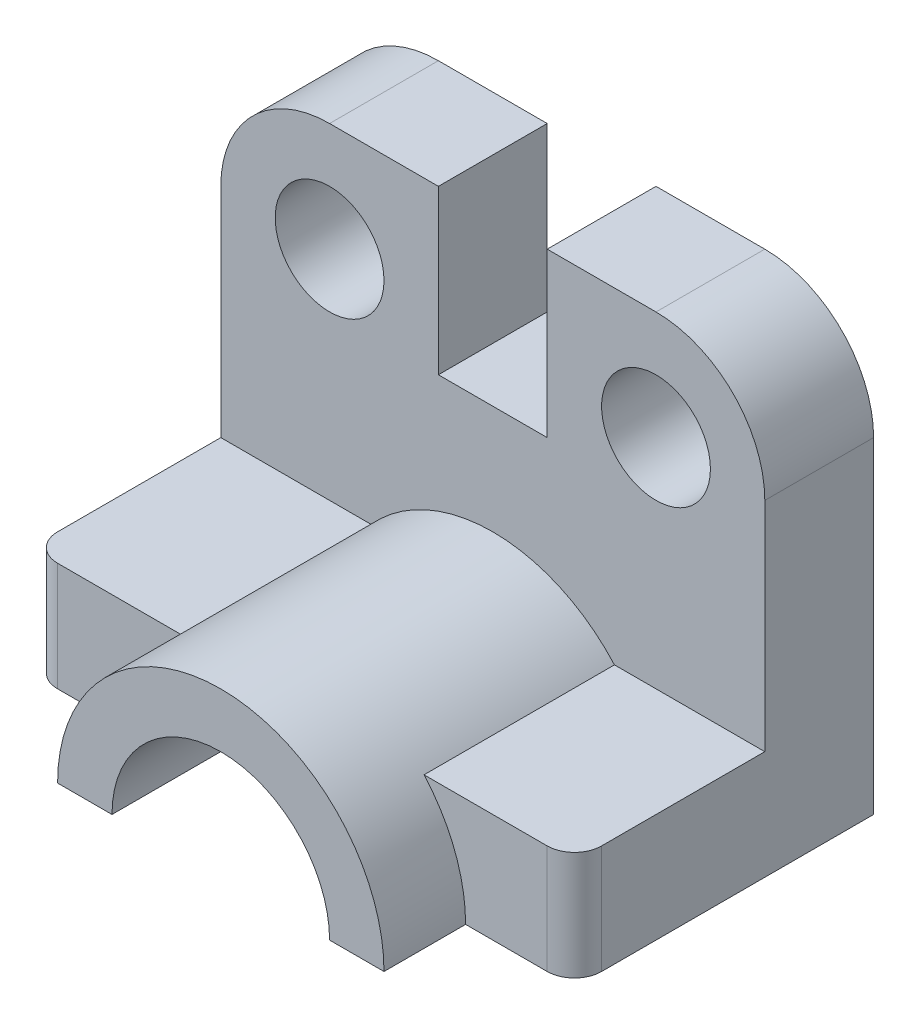
ISO-10303-21;
HEADER;
FILE_DESCRIPTION(('STEP AP214'),'2;1');
FILE_NAME('part.step','',(''),(''),'','','');
FILE_SCHEMA(('AUTOMOTIVE_DESIGN { 1 0 10303 214 1 1 1 1 }'));
ENDSEC;
DATA;
#1=APPLICATION_CONTEXT('core data for automotive mechanical design processes');
#2=APPLICATION_PROTOCOL_DEFINITION('international standard','automotive_design',2000,#1);
#3=PRODUCT_CONTEXT('',#1,'mechanical');
#4=PRODUCT('Part','Part','',(#3));
#5=PRODUCT_RELATED_PRODUCT_CATEGORY('part','',(#4));
#6=PRODUCT_DEFINITION_FORMATION('','',#4);
#7=PRODUCT_DEFINITION_CONTEXT('part definition',#1,'design');
#8=PRODUCT_DEFINITION('design','',#6,#7);
#9=PRODUCT_DEFINITION_SHAPE('','',#8);
#10=(LENGTH_UNIT() NAMED_UNIT(*) SI_UNIT(.MILLI.,.METRE.));
#11=(NAMED_UNIT(*) PLANE_ANGLE_UNIT() SI_UNIT($,.RADIAN.));
#12=(NAMED_UNIT(*) SI_UNIT($,.STERADIAN.) SOLID_ANGLE_UNIT());
#13=UNCERTAINTY_MEASURE_WITH_UNIT(LENGTH_MEASURE(1.E-05),#10,'distance_accuracy_value','');
#14=(GEOMETRIC_REPRESENTATION_CONTEXT(3) GLOBAL_UNCERTAINTY_ASSIGNED_CONTEXT((#13)) GLOBAL_UNIT_ASSIGNED_CONTEXT((#10,
#11,#12)) REPRESENTATION_CONTEXT('',''));
#15=CARTESIAN_POINT('',(0.,0.,0.));
#16=DIRECTION('',(0.,0.,1.));
#17=DIRECTION('',(1.,0.,0.));
#18=AXIS2_PLACEMENT_3D('',#15,#16,#17);
#19=CARTESIAN_POINT('',(-50.,0.,20.));
#20=DIRECTION('',(0.,1.,0.));
#21=DIRECTION('',(0.,0.,1.));
#22=AXIS2_PLACEMENT_3D('',#19,#20,#21);
#23=PLANE('',#22);
#24=DIRECTION('',(-1.,0.,0.));
#25=VECTOR('',#24,1.);
#26=CARTESIAN_POINT('',(0.,0.,20.));
#27=LINE('',#26,#25);
#28=CARTESIAN_POINT('',(20.,0.,20.));
#29=VERTEX_POINT('',#28);
#30=CARTESIAN_POINT('',(-20.,0.,20.));
#31=VERTEX_POINT('',#30);
#32=EDGE_CURVE('E187',#29,#31,#27,.T.);
#33=ORIENTED_EDGE('',*,*,#32,.T.);
#34=DIRECTION('',(0.,0.,-1.));
#35=VECTOR('',#34,1.);
#36=CARTESIAN_POINT('',(-20.,0.,70.));
#37=LINE('',#36,#35);
#38=CARTESIAN_POINT('',(-20.,0.,70.));
#39=VERTEX_POINT('',#38);
#40=EDGE_CURVE('E194',#39,#31,#37,.T.);
#41=ORIENTED_EDGE('',*,*,#40,.F.);
#42=DIRECTION('',(1.,0.,0.));
#43=VECTOR('',#42,1.);
#44=CARTESIAN_POINT('',(0.,0.,70.));
#45=LINE('',#44,#43);
#46=CARTESIAN_POINT('',(-30.,0.,70.));
#47=VERTEX_POINT('',#46);
#48=EDGE_CURVE('E231',#47,#39,#45,.T.);
#49=ORIENTED_EDGE('',*,*,#48,.F.);
#50=DIRECTION('',(0.,0.,-1.));
#51=VECTOR('',#50,1.);
#52=CARTESIAN_POINT('',(-30.,0.,70.));
#53=LINE('',#52,#51);
#54=CARTESIAN_POINT('',(-30.,0.,55.));
#55=VERTEX_POINT('',#54);
#56=EDGE_CURVE('E237',#47,#55,#53,.T.);
#57=ORIENTED_EDGE('',*,*,#56,.T.);
#58=DIRECTION('',(1.,0.,0.));
#59=VECTOR('',#58,1.);
#60=CARTESIAN_POINT('',(-50.,0.,55.));
#61=LINE('',#60,#59);
#62=CARTESIAN_POINT('',(-45.,0.,55.));
#63=VERTEX_POINT('',#62);
#64=EDGE_CURVE('E209',#63,#55,#61,.T.);
#65=ORIENTED_EDGE('',*,*,#64,.F.);
#66=CARTESIAN_POINT('',(-45.,0.,50.));
#67=DIRECTION('',(0.,1.,0.));
#68=DIRECTION('',(0.,0.,1.));
#69=AXIS2_PLACEMENT_3D('',#66,#67,#68);
#70=CIRCLE('',#69,5.);
#71=CARTESIAN_POINT('',(-50.,0.,50.));
#72=VERTEX_POINT('',#71);
#73=EDGE_CURVE('E333',#63,#72,#70,.F.);
#74=ORIENTED_EDGE('',*,*,#73,.T.);
#75=DIRECTION('',(0.,0.,-1.));
#76=VECTOR('',#75,1.);
#77=CARTESIAN_POINT('',(-50.,0.,20.));
#78=LINE('',#77,#76);
#79=CARTESIAN_POINT('',(-50.,0.,0.));
#80=VERTEX_POINT('',#79);
#81=EDGE_CURVE('E305',#72,#80,#78,.T.);
#82=ORIENTED_EDGE('',*,*,#81,.T.);
#83=DIRECTION('',(1.,0.,0.));
#84=VECTOR('',#83,1.);
#85=CARTESIAN_POINT('',(-50.,0.,0.));
#86=LINE('',#85,#84);
#87=CARTESIAN_POINT('',(50.,0.,0.));
#88=VERTEX_POINT('',#87);
#89=EDGE_CURVE('E276',#80,#88,#86,.T.);
#90=ORIENTED_EDGE('',*,*,#89,.T.);
#91=DIRECTION('',(0.,0.,-1.));
#92=VECTOR('',#91,1.);
#93=CARTESIAN_POINT('',(50.,0.,20.));
#94=LINE('',#93,#92);
#95=CARTESIAN_POINT('',(50.,0.,50.));
#96=VERTEX_POINT('',#95);
#97=EDGE_CURVE('E303',#96,#88,#94,.T.);
#98=ORIENTED_EDGE('',*,*,#97,.F.);
#99=CARTESIAN_POINT('',(45.,0.,50.));
#100=DIRECTION('',(0.,1.,0.));
#101=DIRECTION('',(0.,0.,1.));
#102=AXIS2_PLACEMENT_3D('',#99,#100,#101);
#103=CIRCLE('',#102,5.);
#104=CARTESIAN_POINT('',(45.,0.,55.));
#105=VERTEX_POINT('',#104);
#106=EDGE_CURVE('E335',#96,#105,#103,.F.);
#107=ORIENTED_EDGE('',*,*,#106,.T.);
#108=CARTESIAN_POINT('',(30.,0.,55.));
#109=VERTEX_POINT('',#108);
#110=EDGE_CURVE('E212',#109,#105,#61,.T.);
#111=ORIENTED_EDGE('',*,*,#110,.F.);
#112=DIRECTION('',(0.,0.,-1.));
#113=VECTOR('',#112,1.);
#114=CARTESIAN_POINT('',(30.,0.,70.));
#115=LINE('',#114,#113);
#116=CARTESIAN_POINT('',(30.,0.,70.));
#117=VERTEX_POINT('',#116);
#118=EDGE_CURVE('E240',#117,#109,#115,.T.);
#119=ORIENTED_EDGE('',*,*,#118,.F.);
#120=CARTESIAN_POINT('',(20.,0.,70.));
#121=VERTEX_POINT('',#120);
#122=EDGE_CURVE('E190',#121,#117,#45,.T.);
#123=ORIENTED_EDGE('',*,*,#122,.F.);
#124=DIRECTION('',(0.,0.,-1.));
#125=VECTOR('',#124,1.);
#126=CARTESIAN_POINT('',(20.,0.,70.));
#127=LINE('',#126,#125);
#128=EDGE_CURVE('E183',#121,#29,#127,.T.);
#129=ORIENTED_EDGE('',*,*,#128,.T.);
#130=EDGE_LOOP('',(#33,#41,#49,#57,#65,#74,#82,#90,#98,#107,#111,#119,#123,#129));
#131=FACE_BOUND('',#130,.T.);
#132=ADVANCED_FACE('F47',(#131),#23,.F.);
#133=CARTESIAN_POINT('',(0.,0.,20.));
#134=DIRECTION('',(0.,0.,1.));
#135=DIRECTION('',(1.,0.,0.));
#136=AXIS2_PLACEMENT_3D('',#133,#134,#135);
#137=PLANE('',#136);
#138=CARTESIAN_POINT('',(-30.,60.,20.));
#139=DIRECTION('',(0.,0.,1.));
#140=DIRECTION('',(1.,0.,0.));
#141=AXIS2_PLACEMENT_3D('',#138,#139,#140);
#142=CIRCLE('',#141,10.);
#143=CARTESIAN_POINT('',(-20.,60.,20.));
#144=VERTEX_POINT('',#143);
#145=EDGE_CURVE('E250',#144,#144,#142,.T.);
#146=ORIENTED_EDGE('',*,*,#145,.F.);
#147=EDGE_LOOP('',(#146));
#148=FACE_BOUND('',#147,.T.);
#149=CARTESIAN_POINT('',(30.,60.,20.));
#150=DIRECTION('',(0.,0.,1.));
#151=DIRECTION('',(1.,0.,0.));
#152=AXIS2_PLACEMENT_3D('',#149,#150,#151);
#153=CIRCLE('',#152,10.);
#154=CARTESIAN_POINT('',(40.,60.,20.));
#155=VERTEX_POINT('',#154);
#156=EDGE_CURVE('E244',#155,#155,#153,.T.);
#157=ORIENTED_EDGE('',*,*,#156,.F.);
#158=EDGE_LOOP('',(#157));
#159=FACE_BOUND('',#158,.T.);
#160=DIRECTION('',(0.,-1.,0.));
#161=VECTOR('',#160,1.);
#162=CARTESIAN_POINT('',(-50.,80.,20.));
#163=LINE('',#162,#161);
#164=CARTESIAN_POINT('',(-50.,60.,20.));
#165=VERTEX_POINT('',#164);
#166=CARTESIAN_POINT('',(-50.,20.,20.));
#167=VERTEX_POINT('',#166);
#168=EDGE_CURVE('E256',#165,#167,#163,.T.);
#169=ORIENTED_EDGE('',*,*,#168,.T.);
#170=DIRECTION('',(-1.,0.,0.));
#171=VECTOR('',#170,1.);
#172=CARTESIAN_POINT('',(-50.,20.,20.));
#173=LINE('',#172,#171);
#174=CARTESIAN_POINT('',(-22.3606797749979,20.,20.));
#175=VERTEX_POINT('',#174);
#176=EDGE_CURVE('E203',#175,#167,#173,.T.);
#177=ORIENTED_EDGE('',*,*,#176,.F.);
#178=CARTESIAN_POINT('',(0.,0.,20.));
#179=DIRECTION('',(0.,0.,1.));
#180=DIRECTION('',(1.,0.,0.));
#181=AXIS2_PLACEMENT_3D('',#178,#179,#180);
#182=CIRCLE('',#181,30.);
#183=CARTESIAN_POINT('',(22.3606797749979,20.,20.));
#184=VERTEX_POINT('',#183);
#185=EDGE_CURVE('E228',#184,#175,#182,.T.);
#186=ORIENTED_EDGE('',*,*,#185,.F.);
#187=CARTESIAN_POINT('',(50.,20.,20.));
#188=VERTEX_POINT('',#187);
#189=EDGE_CURVE('E206',#188,#184,#173,.T.);
#190=ORIENTED_EDGE('',*,*,#189,.F.);
#191=DIRECTION('',(0.,1.,0.));
#192=VECTOR('',#191,1.);
#193=CARTESIAN_POINT('',(50.,80.,20.));
#194=LINE('',#193,#192);
#195=CARTESIAN_POINT('',(50.,60.,20.));
#196=VERTEX_POINT('',#195);
#197=EDGE_CURVE('E259',#188,#196,#194,.T.);
#198=ORIENTED_EDGE('',*,*,#197,.T.);
#199=CARTESIAN_POINT('',(30.,60.,20.));
#200=DIRECTION('',(0.,0.,1.));
#201=DIRECTION('',(1.,0.,0.));
#202=AXIS2_PLACEMENT_3D('',#199,#200,#201);
#203=CIRCLE('',#202,20.);
#204=CARTESIAN_POINT('',(30.,80.,20.));
#205=VERTEX_POINT('',#204);
#206=EDGE_CURVE('E316',#196,#205,#203,.T.);
#207=ORIENTED_EDGE('',*,*,#206,.T.);
#208=DIRECTION('',(-1.,0.,0.));
#209=VECTOR('',#208,1.);
#210=CARTESIAN_POINT('',(9.99999999999999,80.,20.));
#211=LINE('',#210,#209);
#212=CARTESIAN_POINT('',(9.99999999999999,80.,20.));
#213=VERTEX_POINT('',#212);
#214=EDGE_CURVE('E262',#205,#213,#211,.T.);
#215=ORIENTED_EDGE('',*,*,#214,.T.);
#216=DIRECTION('',(0.,-1.,0.));
#217=VECTOR('',#216,1.);
#218=CARTESIAN_POINT('',(9.99999999999999,80.,20.));
#219=LINE('',#218,#217);
#220=CARTESIAN_POINT('',(10.,50.,20.));
#221=VERTEX_POINT('',#220);
#222=EDGE_CURVE('E264',#213,#221,#219,.T.);
#223=ORIENTED_EDGE('',*,*,#222,.T.);
#224=DIRECTION('',(-1.,0.,0.));
#225=VECTOR('',#224,1.);
#226=CARTESIAN_POINT('',(-10.,50.,20.));
#227=LINE('',#226,#225);
#228=CARTESIAN_POINT('',(-10.,50.,20.));
#229=VERTEX_POINT('',#228);
#230=EDGE_CURVE('E266',#221,#229,#227,.T.);
#231=ORIENTED_EDGE('',*,*,#230,.T.);
#232=DIRECTION('',(0.,1.,0.));
#233=VECTOR('',#232,1.);
#234=CARTESIAN_POINT('',(-10.,80.,20.));
#235=LINE('',#234,#233);
#236=CARTESIAN_POINT('',(-10.,80.,20.));
#237=VERTEX_POINT('',#236);
#238=EDGE_CURVE('E268',#229,#237,#235,.T.);
#239=ORIENTED_EDGE('',*,*,#238,.T.);
#240=DIRECTION('',(-1.,0.,0.));
#241=VECTOR('',#240,1.);
#242=CARTESIAN_POINT('',(-50.,80.,20.));
#243=LINE('',#242,#241);
#244=CARTESIAN_POINT('',(-30.,80.,20.));
#245=VERTEX_POINT('',#244);
#246=EDGE_CURVE('E270',#237,#245,#243,.T.);
#247=ORIENTED_EDGE('',*,*,#246,.T.);
#248=CARTESIAN_POINT('',(-30.,60.,20.));
#249=DIRECTION('',(0.,0.,1.));
#250=DIRECTION('',(1.,0.,0.));
#251=AXIS2_PLACEMENT_3D('',#248,#249,#250);
#252=CIRCLE('',#251,20.);
#253=EDGE_CURVE('E318',#245,#165,#252,.T.);
#254=ORIENTED_EDGE('',*,*,#253,.T.);
#255=EDGE_LOOP('',(#169,#177,#186,#190,#198,#207,#215,#223,#231,#239,#247,#254));
#256=FACE_BOUND('',#255,.T.);
#257=ADVANCED_FACE('F354',(#148,#159,#256),#137,.T.);
#258=CARTESIAN_POINT('',(0.,0.,70.));
#259=DIRECTION('',(0.,0.,-1.));
#260=DIRECTION('',(-1.,0.,0.));
#261=AXIS2_PLACEMENT_3D('',#258,#259,#260);
#262=CYLINDRICAL_SURFACE('',#261,30.);
#263=DIRECTION('',(0.,0.,-1.));
#264=VECTOR('',#263,1.);
#265=CARTESIAN_POINT('',(22.3606797749979,20.,70.));
#266=LINE('',#265,#264);
#267=CARTESIAN_POINT('',(22.3606797749979,20.,55.));
#268=VERTEX_POINT('',#267);
#269=EDGE_CURVE('E223',#184,#268,#266,.F.);
#270=ORIENTED_EDGE('',*,*,#269,.F.);
#271=ORIENTED_EDGE('',*,*,#185,.T.);
#272=DIRECTION('',(0.,0.,-1.));
#273=VECTOR('',#272,1.);
#274=CARTESIAN_POINT('',(-22.3606797749979,20.,70.));
#275=LINE('',#274,#273);
#276=CARTESIAN_POINT('',(-22.3606797749979,20.,55.));
#277=VERTEX_POINT('',#276);
#278=EDGE_CURVE('E226',#277,#175,#275,.T.);
#279=ORIENTED_EDGE('',*,*,#278,.F.);
#280=CARTESIAN_POINT('',(0.,0.,55.));
#281=DIRECTION('',(0.,0.,1.));
#282=DIRECTION('',(1.,0.,0.));
#283=AXIS2_PLACEMENT_3D('',#280,#281,#282);
#284=CIRCLE('',#283,30.);
#285=EDGE_CURVE('E219',#277,#55,#284,.T.);
#286=ORIENTED_EDGE('',*,*,#285,.T.);
#287=ORIENTED_EDGE('',*,*,#56,.F.);
#288=CARTESIAN_POINT('',(0.,0.,70.));
#289=DIRECTION('',(0.,0.,1.));
#290=DIRECTION('',(1.,0.,0.));
#291=AXIS2_PLACEMENT_3D('',#288,#289,#290);
#292=CIRCLE('',#291,30.);
#293=EDGE_CURVE('E230',#117,#47,#292,.T.);
#294=ORIENTED_EDGE('',*,*,#293,.F.);
#295=ORIENTED_EDGE('',*,*,#118,.T.);
#296=EDGE_CURVE('E222',#109,#268,#284,.T.);
#297=ORIENTED_EDGE('',*,*,#296,.T.);
#298=EDGE_LOOP('',(#270,#271,#279,#286,#287,#294,#295,#297));
#299=FACE_BOUND('',#298,.T.);
#300=ADVANCED_FACE('F348',(#299),#262,.T.);
#301=CARTESIAN_POINT('',(0.,0.,0.));
#302=DIRECTION('',(0.,0.,1.));
#303=DIRECTION('',(1.,0.,0.));
#304=AXIS2_PLACEMENT_3D('',#301,#302,#303);
#305=PLANE('',#304);
#306=DIRECTION('',(0.,-1.,0.));
#307=VECTOR('',#306,1.);
#308=CARTESIAN_POINT('',(-50.,80.,0.));
#309=LINE('',#308,#307);
#310=CARTESIAN_POINT('',(-50.,60.,0.));
#311=VERTEX_POINT('',#310);
#312=EDGE_CURVE('E253',#311,#80,#309,.T.);
#313=ORIENTED_EDGE('',*,*,#312,.F.);
#314=CARTESIAN_POINT('',(-30.,60.,0.));
#315=DIRECTION('',(0.,0.,1.));
#316=DIRECTION('',(1.,0.,0.));
#317=AXIS2_PLACEMENT_3D('',#314,#315,#316);
#318=CIRCLE('',#317,20.);
#319=CARTESIAN_POINT('',(-30.,80.,0.));
#320=VERTEX_POINT('',#319);
#321=EDGE_CURVE('E312',#311,#320,#318,.F.);
#322=ORIENTED_EDGE('',*,*,#321,.T.);
#323=DIRECTION('',(-1.,0.,0.));
#324=VECTOR('',#323,1.);
#325=CARTESIAN_POINT('',(-50.,80.,0.));
#326=LINE('',#325,#324);
#327=CARTESIAN_POINT('',(-10.,80.,0.));
#328=VERTEX_POINT('',#327);
#329=EDGE_CURVE('E260',#328,#320,#326,.T.);
#330=ORIENTED_EDGE('',*,*,#329,.F.);
#331=DIRECTION('',(0.,1.,0.));
#332=VECTOR('',#331,1.);
#333=CARTESIAN_POINT('',(-10.,80.,0.));
#334=LINE('',#333,#332);
#335=CARTESIAN_POINT('',(-10.,50.,0.));
#336=VERTEX_POINT('',#335);
#337=EDGE_CURVE('E288',#336,#328,#334,.T.);
#338=ORIENTED_EDGE('',*,*,#337,.F.);
#339=DIRECTION('',(-1.,0.,0.));
#340=VECTOR('',#339,1.);
#341=CARTESIAN_POINT('',(-10.,50.,0.));
#342=LINE('',#341,#340);
#343=CARTESIAN_POINT('',(10.,50.,0.));
#344=VERTEX_POINT('',#343);
#345=EDGE_CURVE('E286',#344,#336,#342,.T.);
#346=ORIENTED_EDGE('',*,*,#345,.F.);
#347=DIRECTION('',(0.,-1.,0.));
#348=VECTOR('',#347,1.);
#349=CARTESIAN_POINT('',(9.99999999999999,80.,0.));
#350=LINE('',#349,#348);
#351=CARTESIAN_POINT('',(9.99999999999999,80.,0.));
#352=VERTEX_POINT('',#351);
#353=EDGE_CURVE('E284',#352,#344,#350,.T.);
#354=ORIENTED_EDGE('',*,*,#353,.F.);
#355=DIRECTION('',(-1.,0.,0.));
#356=VECTOR('',#355,1.);
#357=CARTESIAN_POINT('',(9.99999999999999,80.,0.));
#358=LINE('',#357,#356);
#359=CARTESIAN_POINT('',(30.,80.,0.));
#360=VERTEX_POINT('',#359);
#361=EDGE_CURVE('E282',#360,#352,#358,.T.);
#362=ORIENTED_EDGE('',*,*,#361,.F.);
#363=CARTESIAN_POINT('',(30.,60.,0.));
#364=DIRECTION('',(0.,0.,1.));
#365=DIRECTION('',(1.,0.,0.));
#366=AXIS2_PLACEMENT_3D('',#363,#364,#365);
#367=CIRCLE('',#366,20.);
#368=CARTESIAN_POINT('',(50.,60.,0.));
#369=VERTEX_POINT('',#368);
#370=EDGE_CURVE('E310',#360,#369,#367,.F.);
#371=ORIENTED_EDGE('',*,*,#370,.T.);
#372=DIRECTION('',(0.,1.,0.));
#373=VECTOR('',#372,1.);
#374=CARTESIAN_POINT('',(50.,80.,0.));
#375=LINE('',#374,#373);
#376=EDGE_CURVE('E279',#88,#369,#375,.T.);
#377=ORIENTED_EDGE('',*,*,#376,.F.);
#378=ORIENTED_EDGE('',*,*,#89,.F.);
#379=EDGE_LOOP('',(#313,#322,#330,#338,#346,#354,#362,#371,#377,#378));
#380=FACE_BOUND('',#379,.T.);
#381=CARTESIAN_POINT('',(-30.,60.,0.));
#382=DIRECTION('',(0.,0.,1.));
#383=DIRECTION('',(1.,0.,0.));
#384=AXIS2_PLACEMENT_3D('',#381,#382,#383);
#385=CIRCLE('',#384,10.);
#386=CARTESIAN_POINT('',(-20.,60.,0.));
#387=VERTEX_POINT('',#386);
#388=EDGE_CURVE('E247',#387,#387,#385,.T.);
#389=ORIENTED_EDGE('',*,*,#388,.T.);
#390=EDGE_LOOP('',(#389));
#391=FACE_BOUND('',#390,.T.);
#392=CARTESIAN_POINT('',(30.,60.,0.));
#393=DIRECTION('',(0.,0.,1.));
#394=DIRECTION('',(1.,0.,0.));
#395=AXIS2_PLACEMENT_3D('',#392,#393,#394);
#396=CIRCLE('',#395,10.);
#397=CARTESIAN_POINT('',(40.,60.,0.));
#398=VERTEX_POINT('',#397);
#399=EDGE_CURVE('E243',#398,#398,#396,.T.);
#400=ORIENTED_EDGE('',*,*,#399,.T.);
#401=EDGE_LOOP('',(#400));
#402=FACE_BOUND('',#401,.T.);
#403=ADVANCED_FACE('F405',(#380,#391,#402),#305,.F.);
#404=CARTESIAN_POINT('',(-50.,80.,20.));
#405=DIRECTION('',(1.,0.,0.));
#406=DIRECTION('',(0.,1.,0.));
#407=AXIS2_PLACEMENT_3D('',#404,#405,#406);
#408=PLANE('',#407);
#409=ORIENTED_EDGE('',*,*,#81,.F.);
#410=DIRECTION('',(0.,-1.,0.));
#411=VECTOR('',#410,1.);
#412=CARTESIAN_POINT('',(-50.,20.,50.));
#413=LINE('',#412,#411);
#414=CARTESIAN_POINT('',(-50.,20.,50.));
#415=VERTEX_POINT('',#414);
#416=EDGE_CURVE('E55',#72,#415,#413,.F.);
#417=ORIENTED_EDGE('',*,*,#416,.T.);
#418=DIRECTION('',(0.,0.,-1.));
#419=VECTOR('',#418,1.);
#420=CARTESIAN_POINT('',(-50.,20.,55.));
#421=LINE('',#420,#419);
#422=EDGE_CURVE('E214',#415,#167,#421,.T.);
#423=ORIENTED_EDGE('',*,*,#422,.T.);
#424=ORIENTED_EDGE('',*,*,#168,.F.);
#425=DIRECTION('',(0.,0.,-1.));
#426=VECTOR('',#425,1.);
#427=CARTESIAN_POINT('',(-50.,60.,20.));
#428=LINE('',#427,#426);
#429=EDGE_CURVE('E307',#165,#311,#428,.T.);
#430=ORIENTED_EDGE('',*,*,#429,.T.);
#431=ORIENTED_EDGE('',*,*,#312,.T.);
#432=EDGE_LOOP('',(#409,#417,#423,#424,#430,#431));
#433=FACE_BOUND('',#432,.T.);
#434=ADVANCED_FACE('F402',(#433),#408,.F.);
#435=CARTESIAN_POINT('',(50.,80.,20.));
#436=DIRECTION('',(-1.,0.,0.));
#437=DIRECTION('',(0.,-1.,0.));
#438=AXIS2_PLACEMENT_3D('',#435,#436,#437);
#439=PLANE('',#438);
#440=DIRECTION('',(0.,0.,-1.));
#441=VECTOR('',#440,1.);
#442=CARTESIAN_POINT('',(50.,20.,55.));
#443=LINE('',#442,#441);
#444=CARTESIAN_POINT('',(50.,20.,50.));
#445=VERTEX_POINT('',#444);
#446=EDGE_CURVE('E217',#445,#188,#443,.T.);
#447=ORIENTED_EDGE('',*,*,#446,.F.);
#448=DIRECTION('',(0.,1.,0.));
#449=VECTOR('',#448,1.);
#450=CARTESIAN_POINT('',(50.,0.,50.));
#451=LINE('',#450,#449);
#452=EDGE_CURVE('E331',#445,#96,#451,.F.);
#453=ORIENTED_EDGE('',*,*,#452,.T.);
#454=ORIENTED_EDGE('',*,*,#97,.T.);
#455=ORIENTED_EDGE('',*,*,#376,.T.);
#456=DIRECTION('',(0.,0.,-1.));
#457=VECTOR('',#456,1.);
#458=CARTESIAN_POINT('',(50.,60.,20.));
#459=LINE('',#458,#457);
#460=EDGE_CURVE('E323',#369,#196,#459,.F.);
#461=ORIENTED_EDGE('',*,*,#460,.T.);
#462=ORIENTED_EDGE('',*,*,#197,.F.);
#463=EDGE_LOOP('',(#447,#453,#454,#455,#461,#462));
#464=FACE_BOUND('',#463,.T.);
#465=ADVANCED_FACE('F364',(#464),#439,.F.);
#466=CARTESIAN_POINT('',(9.99999999999999,80.,20.));
#467=DIRECTION('',(0.,-1.,0.));
#468=DIRECTION('',(0.,0.,-1.));
#469=AXIS2_PLACEMENT_3D('',#466,#467,#468);
#470=PLANE('',#469);
#471=ORIENTED_EDGE('',*,*,#214,.F.);
#472=DIRECTION('',(0.,0.,-1.));
#473=VECTOR('',#472,1.);
#474=CARTESIAN_POINT('',(30.,80.,20.));
#475=LINE('',#474,#473);
#476=EDGE_CURVE('E320',#205,#360,#475,.T.);
#477=ORIENTED_EDGE('',*,*,#476,.T.);
#478=ORIENTED_EDGE('',*,*,#361,.T.);
#479=DIRECTION('',(0.,0.,-1.));
#480=VECTOR('',#479,1.);
#481=CARTESIAN_POINT('',(9.99999999999999,80.,20.));
#482=LINE('',#481,#480);
#483=EDGE_CURVE('E300',#213,#352,#482,.T.);
#484=ORIENTED_EDGE('',*,*,#483,.F.);
#485=EDGE_LOOP('',(#471,#477,#478,#484));
#486=FACE_BOUND('',#485,.T.);
#487=ADVANCED_FACE('F375',(#486),#470,.F.);
#488=CARTESIAN_POINT('',(9.99999999999999,80.,20.));
#489=DIRECTION('',(1.,0.,0.));
#490=DIRECTION('',(0.,1.,0.));
#491=AXIS2_PLACEMENT_3D('',#488,#489,#490);
#492=PLANE('',#491);
#493=ORIENTED_EDGE('',*,*,#353,.T.);
#494=DIRECTION('',(0.,0.,-1.));
#495=VECTOR('',#494,1.);
#496=CARTESIAN_POINT('',(10.,50.,20.));
#497=LINE('',#496,#495);
#498=EDGE_CURVE('E297',#221,#344,#497,.T.);
#499=ORIENTED_EDGE('',*,*,#498,.F.);
#500=ORIENTED_EDGE('',*,*,#222,.F.);
#501=ORIENTED_EDGE('',*,*,#483,.T.);
#502=EDGE_LOOP('',(#493,#499,#500,#501));
#503=FACE_BOUND('',#502,.T.);
#504=ADVANCED_FACE('F381',(#503),#492,.F.);
#505=CARTESIAN_POINT('',(-10.,50.,20.));
#506=DIRECTION('',(0.,-1.,0.));
#507=DIRECTION('',(0.,0.,-1.));
#508=AXIS2_PLACEMENT_3D('',#505,#506,#507);
#509=PLANE('',#508);
#510=ORIENTED_EDGE('',*,*,#345,.T.);
#511=DIRECTION('',(0.,0.,-1.));
#512=VECTOR('',#511,1.);
#513=CARTESIAN_POINT('',(-10.,50.,20.));
#514=LINE('',#513,#512);
#515=EDGE_CURVE('E294',#229,#336,#514,.T.);
#516=ORIENTED_EDGE('',*,*,#515,.F.);
#517=ORIENTED_EDGE('',*,*,#230,.F.);
#518=ORIENTED_EDGE('',*,*,#498,.T.);
#519=EDGE_LOOP('',(#510,#516,#517,#518));
#520=FACE_BOUND('',#519,.T.);
#521=ADVANCED_FACE('F387',(#520),#509,.F.);
#522=CARTESIAN_POINT('',(-10.,80.,20.));
#523=DIRECTION('',(-1.,0.,0.));
#524=DIRECTION('',(0.,-1.,0.));
#525=AXIS2_PLACEMENT_3D('',#522,#523,#524);
#526=PLANE('',#525);
#527=ORIENTED_EDGE('',*,*,#337,.T.);
#528=DIRECTION('',(0.,0.,-1.));
#529=VECTOR('',#528,1.);
#530=CARTESIAN_POINT('',(-10.,80.,20.));
#531=LINE('',#530,#529);
#532=EDGE_CURVE('E273',#237,#328,#531,.T.);
#533=ORIENTED_EDGE('',*,*,#532,.F.);
#534=ORIENTED_EDGE('',*,*,#238,.F.);
#535=ORIENTED_EDGE('',*,*,#515,.T.);
#536=EDGE_LOOP('',(#527,#533,#534,#535));
#537=FACE_BOUND('',#536,.T.);
#538=ADVANCED_FACE('F391',(#537),#526,.F.);
#539=CARTESIAN_POINT('',(-50.,80.,20.));
#540=DIRECTION('',(0.,-1.,0.));
#541=DIRECTION('',(0.,0.,-1.));
#542=AXIS2_PLACEMENT_3D('',#539,#540,#541);
#543=PLANE('',#542);
#544=ORIENTED_EDGE('',*,*,#329,.T.);
#545=DIRECTION('',(0.,0.,-1.));
#546=VECTOR('',#545,1.);
#547=CARTESIAN_POINT('',(-30.,80.,20.));
#548=LINE('',#547,#546);
#549=EDGE_CURVE('E314',#320,#245,#548,.F.);
#550=ORIENTED_EDGE('',*,*,#549,.T.);
#551=ORIENTED_EDGE('',*,*,#246,.F.);
#552=ORIENTED_EDGE('',*,*,#532,.T.);
#553=EDGE_LOOP('',(#544,#550,#551,#552));
#554=FACE_BOUND('',#553,.T.);
#555=ADVANCED_FACE('F395',(#554),#543,.F.);
#556=CARTESIAN_POINT('',(-30.,60.,20.));
#557=DIRECTION('',(0.,0.,-1.));
#558=DIRECTION('',(-1.,0.,0.));
#559=AXIS2_PLACEMENT_3D('',#556,#557,#558);
#560=CYLINDRICAL_SURFACE('',#559,10.);
#561=ORIENTED_EDGE('',*,*,#145,.T.);
#562=EDGE_LOOP('',(#561));
#563=FACE_BOUND('',#562,.T.);
#564=ORIENTED_EDGE('',*,*,#388,.F.);
#565=EDGE_LOOP('',(#564));
#566=FACE_BOUND('',#565,.T.);
#567=ADVANCED_FACE('F450',(#563,#566),#560,.F.);
#568=CARTESIAN_POINT('',(30.,60.,20.));
#569=DIRECTION('',(0.,0.,-1.));
#570=DIRECTION('',(-1.,0.,0.));
#571=AXIS2_PLACEMENT_3D('',#568,#569,#570);
#572=CYLINDRICAL_SURFACE('',#571,10.);
#573=ORIENTED_EDGE('',*,*,#156,.T.);
#574=EDGE_LOOP('',(#573));
#575=FACE_BOUND('',#574,.T.);
#576=ORIENTED_EDGE('',*,*,#399,.F.);
#577=EDGE_LOOP('',(#576));
#578=FACE_BOUND('',#577,.T.);
#579=ADVANCED_FACE('F432',(#575,#578),#572,.F.);
#580=CARTESIAN_POINT('',(-30.,60.,20.));
#581=DIRECTION('',(0.,0.,-1.));
#582=DIRECTION('',(-1.,0.,0.));
#583=AXIS2_PLACEMENT_3D('',#580,#581,#582);
#584=CYLINDRICAL_SURFACE('',#583,20.);
#585=ORIENTED_EDGE('',*,*,#253,.F.);
#586=ORIENTED_EDGE('',*,*,#549,.F.);
#587=ORIENTED_EDGE('',*,*,#321,.F.);
#588=ORIENTED_EDGE('',*,*,#429,.F.);
#589=EDGE_LOOP('',(#585,#586,#587,#588));
#590=FACE_BOUND('',#589,.T.);
#591=ADVANCED_FACE('F400',(#590),#584,.T.);
#592=CARTESIAN_POINT('',(30.,60.,20.));
#593=DIRECTION('',(0.,0.,-1.));
#594=DIRECTION('',(-1.,0.,0.));
#595=AXIS2_PLACEMENT_3D('',#592,#593,#594);
#596=CYLINDRICAL_SURFACE('',#595,20.);
#597=ORIENTED_EDGE('',*,*,#206,.F.);
#598=ORIENTED_EDGE('',*,*,#460,.F.);
#599=ORIENTED_EDGE('',*,*,#370,.F.);
#600=ORIENTED_EDGE('',*,*,#476,.F.);
#601=EDGE_LOOP('',(#597,#598,#599,#600));
#602=FACE_BOUND('',#601,.T.);
#603=ADVANCED_FACE('F371',(#602),#596,.T.);
#604=CARTESIAN_POINT('',(0.,0.,70.));
#605=DIRECTION('',(0.,0.,-1.));
#606=DIRECTION('',(-1.,0.,0.));
#607=AXIS2_PLACEMENT_3D('',#604,#605,#606);
#608=CYLINDRICAL_SURFACE('',#607,20.);
#609=ORIENTED_EDGE('',*,*,#40,.T.);
#610=CARTESIAN_POINT('',(0.,0.,20.));
#611=DIRECTION('',(0.,0.,1.));
#612=DIRECTION('',(1.,0.,0.));
#613=AXIS2_PLACEMENT_3D('',#610,#611,#612);
#614=CIRCLE('',#613,20.);
#615=EDGE_CURVE('E198',#29,#31,#614,.T.);
#616=ORIENTED_EDGE('',*,*,#615,.F.);
#617=ORIENTED_EDGE('',*,*,#128,.F.);
#618=CARTESIAN_POINT('',(0.,0.,70.));
#619=DIRECTION('',(0.,0.,1.));
#620=DIRECTION('',(1.,0.,0.));
#621=AXIS2_PLACEMENT_3D('',#618,#619,#620);
#622=CIRCLE('',#621,20.);
#623=EDGE_CURVE('E195',#121,#39,#622,.T.);
#624=ORIENTED_EDGE('',*,*,#623,.T.);
#625=EDGE_LOOP('',(#609,#616,#617,#624));
#626=FACE_BOUND('',#625,.T.);
#627=ADVANCED_FACE('F199',(#626),#608,.F.);
#628=CARTESIAN_POINT('',(0.,0.,70.));
#629=DIRECTION('',(0.,0.,1.));
#630=DIRECTION('',(1.,0.,0.));
#631=AXIS2_PLACEMENT_3D('',#628,#629,#630);
#632=PLANE('',#631);
#633=ORIENTED_EDGE('',*,*,#122,.T.);
#634=ORIENTED_EDGE('',*,*,#293,.T.);
#635=ORIENTED_EDGE('',*,*,#48,.T.);
#636=ORIENTED_EDGE('',*,*,#623,.F.);
#637=EDGE_LOOP('',(#633,#634,#635,#636));
#638=FACE_BOUND('',#637,.T.);
#639=ADVANCED_FACE('F437',(#638),#632,.T.);
#640=CARTESIAN_POINT('',(0.,0.,55.));
#641=DIRECTION('',(0.,0.,1.));
#642=DIRECTION('',(1.,0.,0.));
#643=AXIS2_PLACEMENT_3D('',#640,#641,#642);
#644=PLANE('',#643);
#645=DIRECTION('',(-1.,0.,0.));
#646=VECTOR('',#645,1.);
#647=CARTESIAN_POINT('',(-50.,20.,55.));
#648=LINE('',#647,#646);
#649=CARTESIAN_POINT('',(-45.,20.,55.));
#650=VERTEX_POINT('',#649);
#651=EDGE_CURVE('E211',#277,#650,#648,.T.);
#652=ORIENTED_EDGE('',*,*,#651,.T.);
#653=DIRECTION('',(0.,-1.,0.));
#654=VECTOR('',#653,1.);
#655=CARTESIAN_POINT('',(-45.,0.,55.));
#656=LINE('',#655,#654);
#657=EDGE_CURVE('E337',#650,#63,#656,.T.);
#658=ORIENTED_EDGE('',*,*,#657,.T.);
#659=ORIENTED_EDGE('',*,*,#64,.T.);
#660=ORIENTED_EDGE('',*,*,#285,.F.);
#661=EDGE_LOOP('',(#652,#658,#659,#660));
#662=FACE_BOUND('',#661,.T.);
#663=ADVANCED_FACE('F342',(#662),#644,.T.);
#664=CARTESIAN_POINT('',(-50.,20.,55.));
#665=DIRECTION('',(0.,-1.,0.));
#666=DIRECTION('',(1.,0.,0.));
#667=AXIS2_PLACEMENT_3D('',#664,#665,#666);
#668=PLANE('',#667);
#669=ORIENTED_EDGE('',*,*,#422,.F.);
#670=CARTESIAN_POINT('',(-45.,20.,50.));
#671=DIRECTION('',(0.,-1.,0.));
#672=DIRECTION('',(1.,0.,0.));
#673=AXIS2_PLACEMENT_3D('',#670,#671,#672);
#674=CIRCLE('',#673,5.);
#675=EDGE_CURVE('E13',#415,#650,#674,.F.);
#676=ORIENTED_EDGE('',*,*,#675,.T.);
#677=ORIENTED_EDGE('',*,*,#651,.F.);
#678=ORIENTED_EDGE('',*,*,#278,.T.);
#679=ORIENTED_EDGE('',*,*,#176,.T.);
#680=EDGE_LOOP('',(#669,#676,#677,#678,#679));
#681=FACE_BOUND('',#680,.T.);
#682=ADVANCED_FACE('F350',(#681),#668,.F.);
#683=CARTESIAN_POINT('',(45.,20.,55.));
#684=VERTEX_POINT('',#683);
#685=EDGE_CURVE('E213',#684,#268,#648,.T.);
#686=ORIENTED_EDGE('',*,*,#685,.F.);
#687=CARTESIAN_POINT('',(45.,20.,50.));
#688=DIRECTION('',(0.,-1.,0.));
#689=DIRECTION('',(1.,0.,0.));
#690=AXIS2_PLACEMENT_3D('',#687,#688,#689);
#691=CIRCLE('',#690,5.);
#692=EDGE_CURVE('E329',#684,#445,#691,.F.);
#693=ORIENTED_EDGE('',*,*,#692,.T.);
#694=ORIENTED_EDGE('',*,*,#446,.T.);
#695=ORIENTED_EDGE('',*,*,#189,.T.);
#696=ORIENTED_EDGE('',*,*,#269,.T.);
#697=EDGE_LOOP('',(#686,#693,#694,#695,#696));
#698=FACE_BOUND('',#697,.T.);
#699=ADVANCED_FACE('F360',(#698),#668,.F.);
#700=ORIENTED_EDGE('',*,*,#110,.T.);
#701=DIRECTION('',(0.,1.,0.));
#702=VECTOR('',#701,1.);
#703=CARTESIAN_POINT('',(45.,20.,55.));
#704=LINE('',#703,#702);
#705=EDGE_CURVE('E326',#105,#684,#704,.T.);
#706=ORIENTED_EDGE('',*,*,#705,.T.);
#707=ORIENTED_EDGE('',*,*,#685,.T.);
#708=ORIENTED_EDGE('',*,*,#296,.F.);
#709=EDGE_LOOP('',(#700,#706,#707,#708));
#710=FACE_BOUND('',#709,.T.);
#711=ADVANCED_FACE('F416',(#710),#644,.T.);
#712=CARTESIAN_POINT('',(45.,0.,50.));
#713=DIRECTION('',(0.,-1.,0.));
#714=DIRECTION('',(1.,0.,0.));
#715=AXIS2_PLACEMENT_3D('',#712,#713,#714);
#716=CYLINDRICAL_SURFACE('',#715,5.);
#717=ORIENTED_EDGE('',*,*,#106,.F.);
#718=ORIENTED_EDGE('',*,*,#452,.F.);
#719=ORIENTED_EDGE('',*,*,#692,.F.);
#720=ORIENTED_EDGE('',*,*,#705,.F.);
#721=EDGE_LOOP('',(#717,#718,#719,#720));
#722=FACE_BOUND('',#721,.T.);
#723=ADVANCED_FACE('F410',(#722),#716,.T.);
#724=CARTESIAN_POINT('',(-45.,0.,50.));
#725=DIRECTION('',(0.,1.,0.));
#726=DIRECTION('',(-1.,0.,0.));
#727=AXIS2_PLACEMENT_3D('',#724,#725,#726);
#728=CYLINDRICAL_SURFACE('',#727,5.);
#729=ORIENTED_EDGE('',*,*,#675,.F.);
#730=ORIENTED_EDGE('',*,*,#416,.F.);
#731=ORIENTED_EDGE('',*,*,#73,.F.);
#732=ORIENTED_EDGE('',*,*,#657,.F.);
#733=EDGE_LOOP('',(#729,#730,#731,#732));
#734=FACE_BOUND('',#733,.T.);
#735=ADVANCED_FACE('F49',(#734),#728,.T.);
#736=CARTESIAN_POINT('',(0.,0.,20.));
#737=DIRECTION('',(0.,0.,1.));
#738=DIRECTION('',(1.,0.,0.));
#739=AXIS2_PLACEMENT_3D('',#736,#737,#738);
#740=PLANE('',#739);
#741=ORIENTED_EDGE('',*,*,#32,.F.);
#742=ORIENTED_EDGE('',*,*,#615,.T.);
#743=EDGE_LOOP('',(#741,#742));
#744=FACE_BOUND('',#743,.T.);
#745=ADVANCED_FACE('F202',(#744),#740,.T.);
#746=CLOSED_SHELL('',(#132,#257,#300,#403,#434,#465,#487,#504,#521,#538,#555,#567,#579,#591,
#603,#627,#639,#663,#682,#699,#711,#723,#735,#745));
#747=MANIFOLD_SOLID_BREP('B2',#746);
#748=ADVANCED_BREP_SHAPE_REPRESENTATION('',(#18,#747),#14);
#749=SHAPE_DEFINITION_REPRESENTATION(#9,#748);
ENDSEC;
END-ISO-10303-21;
